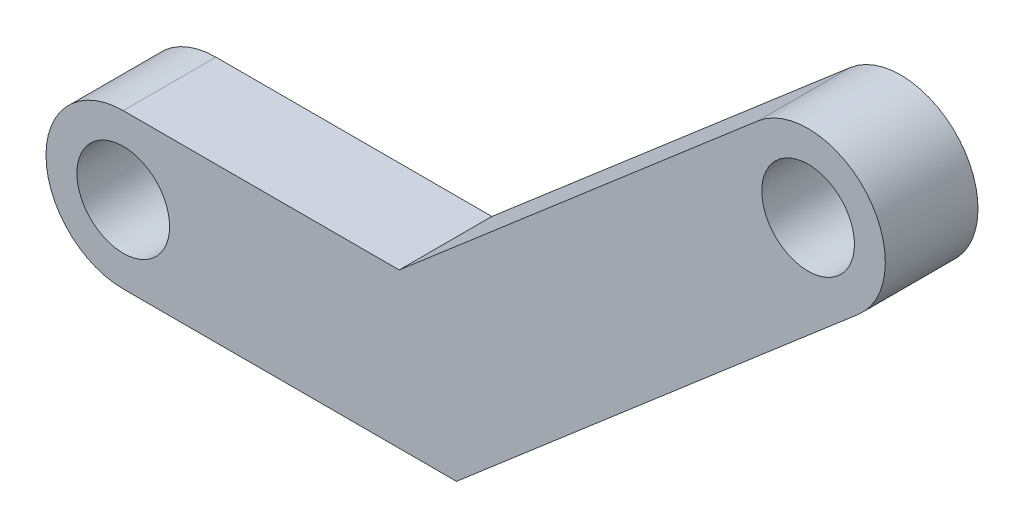
ISO-10303-21;
HEADER;
FILE_DESCRIPTION(('STEP AP214'),'2;1');
FILE_NAME('part.step','',(''),(''),'','','');
FILE_SCHEMA(('AUTOMOTIVE_DESIGN { 1 0 10303 214 1 1 1 1 }'));
ENDSEC;
DATA;
#1=APPLICATION_CONTEXT('core data for automotive mechanical design processes');
#2=APPLICATION_PROTOCOL_DEFINITION('international standard','automotive_design',2000,#1);
#3=PRODUCT_CONTEXT('',#1,'mechanical');
#4=PRODUCT('Part','Part','',(#3));
#5=PRODUCT_RELATED_PRODUCT_CATEGORY('part','',(#4));
#6=PRODUCT_DEFINITION_FORMATION('','',#4);
#7=PRODUCT_DEFINITION_CONTEXT('part definition',#1,'design');
#8=PRODUCT_DEFINITION('design','',#6,#7);
#9=PRODUCT_DEFINITION_SHAPE('','',#8);
#10=(LENGTH_UNIT() NAMED_UNIT(*) SI_UNIT(.MILLI.,.METRE.));
#11=(NAMED_UNIT(*) PLANE_ANGLE_UNIT() SI_UNIT($,.RADIAN.));
#12=(NAMED_UNIT(*) SI_UNIT($,.STERADIAN.) SOLID_ANGLE_UNIT());
#13=UNCERTAINTY_MEASURE_WITH_UNIT(LENGTH_MEASURE(1.E-05),#10,'distance_accuracy_value','');
#14=(GEOMETRIC_REPRESENTATION_CONTEXT(3) GLOBAL_UNCERTAINTY_ASSIGNED_CONTEXT((#13)) GLOBAL_UNIT_ASSIGNED_CONTEXT((#10,
#11,#12)) REPRESENTATION_CONTEXT('',''));
#15=CARTESIAN_POINT('',(0.,0.,0.));
#16=DIRECTION('',(0.,0.,1.));
#17=DIRECTION('',(1.,0.,0.));
#18=AXIS2_PLACEMENT_3D('',#15,#16,#17);
#19=CARTESIAN_POINT('',(91.988845386276,116.522530275384,30.));
#20=DIRECTION('',(0.,0.,-1.));
#21=DIRECTION('',(-1.,0.,0.));
#22=AXIS2_PLACEMENT_3D('',#19,#20,#21);
#23=PLANE('',#22);
#24=CARTESIAN_POINT('',(91.988845386276,116.522530275384,30.));
#25=DIRECTION('',(0.,0.,1.));
#26=DIRECTION('',(-1.,0.,0.));
#27=AXIS2_PLACEMENT_3D('',#24,#25,#26);
#28=CIRCLE('',#27,25.);
#29=CARTESIAN_POINT('',(108.287997248667,97.5663268430852,30.));
#30=VERTEX_POINT('',#29);
#31=CARTESIAN_POINT('',(75.6896935238848,135.478733707683,30.));
#32=VERTEX_POINT('',#31);
#33=EDGE_CURVE('E133',#30,#32,#28,.T.);
#34=ORIENTED_EDGE('',*,*,#33,.T.);
#35=DIRECTION('',(-0.758248137291966,-0.651966074495648,0.));
#36=VECTOR('',#35,1.);
#37=CARTESIAN_POINT('',(75.6896935238848,135.478733707683,30.));
#38=LINE('',#37,#36);
#39=CARTESIAN_POINT('',(-40.3812636027174,35.6772009916923,30.));
#40=VERTEX_POINT('',#39);
#41=EDGE_CURVE('E91',#32,#40,#38,.T.);
#42=ORIENTED_EDGE('',*,*,#41,.T.);
#43=DIRECTION('',(-1.,0.,0.));
#44=VECTOR('',#43,1.);
#45=CARTESIAN_POINT('',(-40.3812636027174,35.6772009916923,30.));
#46=LINE('',#45,#44);
#47=CARTESIAN_POINT('',(-129.711154613724,35.6772009916923,30.));
#48=VERTEX_POINT('',#47);
#49=EDGE_CURVE('E104',#40,#48,#46,.T.);
#50=ORIENTED_EDGE('',*,*,#49,.T.);
#51=CARTESIAN_POINT('',(-129.711154613724,10.6772009916922,30.));
#52=DIRECTION('',(0.,0.,1.));
#53=DIRECTION('',(1.,0.,0.));
#54=AXIS2_PLACEMENT_3D('',#51,#52,#53);
#55=CIRCLE('',#54,25.);
#56=CARTESIAN_POINT('',(-129.711154613724,-14.3227990083078,30.));
#57=VERTEX_POINT('',#56);
#58=EDGE_CURVE('E98',#48,#57,#55,.T.);
#59=ORIENTED_EDGE('',*,*,#58,.T.);
#60=DIRECTION('',(1.,0.,0.));
#61=VECTOR('',#60,1.);
#62=CARTESIAN_POINT('',(-21.8410456247305,-14.3227990083077,30.));
#63=LINE('',#62,#61);
#64=CARTESIAN_POINT('',(-21.8410456247305,-14.3227990083077,30.));
#65=VERTEX_POINT('',#64);
#66=EDGE_CURVE('E102',#57,#65,#63,.T.);
#67=ORIENTED_EDGE('',*,*,#66,.T.);
#68=DIRECTION('',(0.758248137291965,0.651966074495648,0.));
#69=VECTOR('',#68,1.);
#70=CARTESIAN_POINT('',(108.287997248667,97.5663268430852,30.));
#71=LINE('',#70,#69);
#72=EDGE_CURVE('E54',#65,#30,#71,.T.);
#73=ORIENTED_EDGE('',*,*,#72,.T.);
#74=EDGE_LOOP('',(#34,#42,#50,#59,#67,#73));
#75=FACE_BOUND('',#74,.T.);
#76=CARTESIAN_POINT('',(91.988845386276,116.522530275384,30.));
#77=DIRECTION('',(0.,0.,1.));
#78=DIRECTION('',(1.,0.,0.));
#79=AXIS2_PLACEMENT_3D('',#76,#77,#78);
#80=CIRCLE('',#79,15.);
#81=CARTESIAN_POINT('',(106.988845386276,116.522530275384,30.));
#82=VERTEX_POINT('',#81);
#83=EDGE_CURVE('E126',#82,#82,#80,.T.);
#84=ORIENTED_EDGE('',*,*,#83,.F.);
#85=EDGE_LOOP('',(#84));
#86=FACE_BOUND('',#85,.T.);
#87=CARTESIAN_POINT('',(-129.711154613724,10.6772009916922,30.));
#88=DIRECTION('',(0.,0.,1.));
#89=DIRECTION('',(1.,0.,0.));
#90=AXIS2_PLACEMENT_3D('',#87,#88,#89);
#91=CIRCLE('',#90,15.);
#92=CARTESIAN_POINT('',(-114.711154613724,10.6772009916922,30.));
#93=VERTEX_POINT('',#92);
#94=EDGE_CURVE('E174',#93,#93,#91,.T.);
#95=ORIENTED_EDGE('',*,*,#94,.F.);
#96=EDGE_LOOP('',(#95));
#97=FACE_BOUND('',#96,.T.);
#98=ADVANCED_FACE('F37',(#75,#86,#97),#23,.F.);
#99=CARTESIAN_POINT('',(91.988845386276,116.522530275384,0.));
#100=DIRECTION('',(0.,0.,-1.));
#101=DIRECTION('',(-1.,0.,0.));
#102=AXIS2_PLACEMENT_3D('',#99,#100,#101);
#103=PLANE('',#102);
#104=CARTESIAN_POINT('',(91.988845386276,116.522530275384,0.));
#105=DIRECTION('',(0.,0.,1.));
#106=DIRECTION('',(1.,0.,0.));
#107=AXIS2_PLACEMENT_3D('',#104,#105,#106);
#108=CIRCLE('',#107,15.);
#109=CARTESIAN_POINT('',(106.988845386276,116.522530275384,0.));
#110=VERTEX_POINT('',#109);
#111=EDGE_CURVE('E179',#110,#110,#108,.T.);
#112=ORIENTED_EDGE('',*,*,#111,.T.);
#113=EDGE_LOOP('',(#112));
#114=FACE_BOUND('',#113,.T.);
#115=CARTESIAN_POINT('',(91.988845386276,116.522530275384,0.));
#116=DIRECTION('',(0.,0.,1.));
#117=DIRECTION('',(-1.,0.,0.));
#118=AXIS2_PLACEMENT_3D('',#115,#116,#117);
#119=CIRCLE('',#118,25.);
#120=CARTESIAN_POINT('',(108.287997248667,97.5663268430852,0.));
#121=VERTEX_POINT('',#120);
#122=CARTESIAN_POINT('',(75.6896935238848,135.478733707683,0.));
#123=VERTEX_POINT('',#122);
#124=EDGE_CURVE('E122',#121,#123,#119,.T.);
#125=ORIENTED_EDGE('',*,*,#124,.F.);
#126=DIRECTION('',(0.758248137291965,0.651966074495648,0.));
#127=VECTOR('',#126,1.);
#128=CARTESIAN_POINT('',(108.287997248667,97.5663268430852,0.));
#129=LINE('',#128,#127);
#130=CARTESIAN_POINT('',(-21.8410456247305,-14.3227990083077,0.));
#131=VERTEX_POINT('',#130);
#132=EDGE_CURVE('E83',#131,#121,#129,.T.);
#133=ORIENTED_EDGE('',*,*,#132,.F.);
#134=DIRECTION('',(1.,0.,0.));
#135=VECTOR('',#134,1.);
#136=CARTESIAN_POINT('',(-21.8410456247305,-14.3227990083077,0.));
#137=LINE('',#136,#135);
#138=CARTESIAN_POINT('',(-129.711154613724,-14.3227990083078,0.));
#139=VERTEX_POINT('',#138);
#140=EDGE_CURVE('E77',#139,#131,#137,.T.);
#141=ORIENTED_EDGE('',*,*,#140,.F.);
#142=CARTESIAN_POINT('',(-129.711154613724,10.6772009916922,0.));
#143=DIRECTION('',(0.,0.,1.));
#144=DIRECTION('',(1.,0.,0.));
#145=AXIS2_PLACEMENT_3D('',#142,#143,#144);
#146=CIRCLE('',#145,25.);
#147=CARTESIAN_POINT('',(-129.711154613724,35.6772009916923,0.));
#148=VERTEX_POINT('',#147);
#149=EDGE_CURVE('E112',#148,#139,#146,.T.);
#150=ORIENTED_EDGE('',*,*,#149,.F.);
#151=DIRECTION('',(-1.,0.,0.));
#152=VECTOR('',#151,1.);
#153=CARTESIAN_POINT('',(-40.3812636027174,35.6772009916923,0.));
#154=LINE('',#153,#152);
#155=CARTESIAN_POINT('',(-40.3812636027174,35.6772009916923,0.));
#156=VERTEX_POINT('',#155);
#157=EDGE_CURVE('E128',#156,#148,#154,.T.);
#158=ORIENTED_EDGE('',*,*,#157,.F.);
#159=DIRECTION('',(-0.758248137291966,-0.651966074495648,0.));
#160=VECTOR('',#159,1.);
#161=CARTESIAN_POINT('',(75.6896935238848,135.478733707683,0.));
#162=LINE('',#161,#160);
#163=EDGE_CURVE('E125',#123,#156,#162,.T.);
#164=ORIENTED_EDGE('',*,*,#163,.F.);
#165=EDGE_LOOP('',(#125,#133,#141,#150,#158,#164));
#166=FACE_BOUND('',#165,.T.);
#167=CARTESIAN_POINT('',(-129.711154613724,10.6772009916922,0.));
#168=DIRECTION('',(0.,0.,1.));
#169=DIRECTION('',(1.,0.,0.));
#170=AXIS2_PLACEMENT_3D('',#167,#168,#169);
#171=CIRCLE('',#170,15.);
#172=CARTESIAN_POINT('',(-114.711154613724,10.6772009916922,0.));
#173=VERTEX_POINT('',#172);
#174=EDGE_CURVE('E177',#173,#173,#171,.T.);
#175=ORIENTED_EDGE('',*,*,#174,.T.);
#176=EDGE_LOOP('',(#175));
#177=FACE_BOUND('',#176,.T.);
#178=ADVANCED_FACE('F142',(#114,#166,#177),#103,.T.);
#179=CARTESIAN_POINT('',(91.988845386276,116.522530275384,30.));
#180=DIRECTION('',(0.,0.,-1.));
#181=DIRECTION('',(-1.,0.,0.));
#182=AXIS2_PLACEMENT_3D('',#179,#180,#181);
#183=CYLINDRICAL_SURFACE('',#182,25.);
#184=ORIENTED_EDGE('',*,*,#124,.T.);
#185=DIRECTION('',(0.,0.,-1.));
#186=VECTOR('',#185,1.);
#187=CARTESIAN_POINT('',(75.6896935238848,135.478733707683,30.));
#188=LINE('',#187,#186);
#189=EDGE_CURVE('E11',#32,#123,#188,.T.);
#190=ORIENTED_EDGE('',*,*,#189,.F.);
#191=ORIENTED_EDGE('',*,*,#33,.F.);
#192=DIRECTION('',(0.,0.,-1.));
#193=VECTOR('',#192,1.);
#194=CARTESIAN_POINT('',(108.287997248667,97.5663268430852,30.));
#195=LINE('',#194,#193);
#196=EDGE_CURVE('E118',#30,#121,#195,.T.);
#197=ORIENTED_EDGE('',*,*,#196,.T.);
#198=EDGE_LOOP('',(#184,#190,#191,#197));
#199=FACE_BOUND('',#198,.T.);
#200=ADVANCED_FACE('F39',(#199),#183,.T.);
#201=CARTESIAN_POINT('',(75.6896935238848,135.478733707683,30.));
#202=DIRECTION('',(0.651966074495648,-0.758248137291966,0.));
#203=DIRECTION('',(0.758248137291966,0.651966074495648,0.));
#204=AXIS2_PLACEMENT_3D('',#201,#202,#203);
#205=PLANE('',#204);
#206=ORIENTED_EDGE('',*,*,#163,.T.);
#207=DIRECTION('',(0.,0.,-1.));
#208=VECTOR('',#207,1.);
#209=CARTESIAN_POINT('',(-40.3812636027174,35.6772009916923,30.));
#210=LINE('',#209,#208);
#211=EDGE_CURVE('E46',#40,#156,#210,.T.);
#212=ORIENTED_EDGE('',*,*,#211,.F.);
#213=ORIENTED_EDGE('',*,*,#41,.F.);
#214=ORIENTED_EDGE('',*,*,#189,.T.);
#215=EDGE_LOOP('',(#206,#212,#213,#214));
#216=FACE_BOUND('',#215,.T.);
#217=ADVANCED_FACE('F226',(#216),#205,.F.);
#218=CARTESIAN_POINT('',(-40.3812636027174,35.6772009916923,30.));
#219=DIRECTION('',(0.,-1.,0.));
#220=DIRECTION('',(0.,0.,-1.));
#221=AXIS2_PLACEMENT_3D('',#218,#219,#220);
#222=PLANE('',#221);
#223=ORIENTED_EDGE('',*,*,#157,.T.);
#224=DIRECTION('',(0.,0.,-1.));
#225=VECTOR('',#224,1.);
#226=CARTESIAN_POINT('',(-129.711154613724,35.6772009916923,30.));
#227=LINE('',#226,#225);
#228=EDGE_CURVE('E113',#48,#148,#227,.T.);
#229=ORIENTED_EDGE('',*,*,#228,.F.);
#230=ORIENTED_EDGE('',*,*,#49,.F.);
#231=ORIENTED_EDGE('',*,*,#211,.T.);
#232=EDGE_LOOP('',(#223,#229,#230,#231));
#233=FACE_BOUND('',#232,.T.);
#234=ADVANCED_FACE('F139',(#233),#222,.F.);
#235=CARTESIAN_POINT('',(-129.711154613724,10.6772009916922,30.));
#236=DIRECTION('',(0.,0.,-1.));
#237=DIRECTION('',(-1.,0.,0.));
#238=AXIS2_PLACEMENT_3D('',#235,#236,#237);
#239=CYLINDRICAL_SURFACE('',#238,25.);
#240=ORIENTED_EDGE('',*,*,#149,.T.);
#241=DIRECTION('',(0.,0.,-1.));
#242=VECTOR('',#241,1.);
#243=CARTESIAN_POINT('',(-129.711154613724,-14.3227990083078,30.));
#244=LINE('',#243,#242);
#245=EDGE_CURVE('E109',#57,#139,#244,.T.);
#246=ORIENTED_EDGE('',*,*,#245,.F.);
#247=ORIENTED_EDGE('',*,*,#58,.F.);
#248=ORIENTED_EDGE('',*,*,#228,.T.);
#249=EDGE_LOOP('',(#240,#246,#247,#248));
#250=FACE_BOUND('',#249,.T.);
#251=ADVANCED_FACE('F110',(#250),#239,.T.);
#252=CARTESIAN_POINT('',(-21.8410456247305,-14.3227990083077,30.));
#253=DIRECTION('',(0.,1.,0.));
#254=DIRECTION('',(0.,0.,1.));
#255=AXIS2_PLACEMENT_3D('',#252,#253,#254);
#256=PLANE('',#255);
#257=ORIENTED_EDGE('',*,*,#140,.T.);
#258=DIRECTION('',(0.,0.,-1.));
#259=VECTOR('',#258,1.);
#260=CARTESIAN_POINT('',(-21.8410456247305,-14.3227990083077,30.));
#261=LINE('',#260,#259);
#262=EDGE_CURVE('E114',#65,#131,#261,.T.);
#263=ORIENTED_EDGE('',*,*,#262,.F.);
#264=ORIENTED_EDGE('',*,*,#66,.F.);
#265=ORIENTED_EDGE('',*,*,#245,.T.);
#266=EDGE_LOOP('',(#257,#263,#264,#265));
#267=FACE_BOUND('',#266,.T.);
#268=ADVANCED_FACE('F116',(#267),#256,.F.);
#269=CARTESIAN_POINT('',(108.287997248667,97.5663268430852,30.));
#270=DIRECTION('',(-0.651966074495648,0.758248137291965,0.));
#271=DIRECTION('',(-0.758248137291966,-0.651966074495648,0.));
#272=AXIS2_PLACEMENT_3D('',#269,#270,#271);
#273=PLANE('',#272);
#274=ORIENTED_EDGE('',*,*,#132,.T.);
#275=ORIENTED_EDGE('',*,*,#196,.F.);
#276=ORIENTED_EDGE('',*,*,#72,.F.);
#277=ORIENTED_EDGE('',*,*,#262,.T.);
#278=EDGE_LOOP('',(#274,#275,#276,#277));
#279=FACE_BOUND('',#278,.T.);
#280=ADVANCED_FACE('F147',(#279),#273,.F.);
#281=CARTESIAN_POINT('',(91.988845386276,116.522530275384,30.));
#282=DIRECTION('',(0.,0.,-1.));
#283=DIRECTION('',(-1.,0.,0.));
#284=AXIS2_PLACEMENT_3D('',#281,#282,#283);
#285=CYLINDRICAL_SURFACE('',#284,15.);
#286=ORIENTED_EDGE('',*,*,#83,.T.);
#287=EDGE_LOOP('',(#286));
#288=FACE_BOUND('',#287,.T.);
#289=ORIENTED_EDGE('',*,*,#111,.F.);
#290=EDGE_LOOP('',(#289));
#291=FACE_BOUND('',#290,.T.);
#292=ADVANCED_FACE('F149',(#288,#291),#285,.F.);
#293=CARTESIAN_POINT('',(-129.711154613724,10.6772009916922,30.));
#294=DIRECTION('',(0.,0.,-1.));
#295=DIRECTION('',(-1.,0.,0.));
#296=AXIS2_PLACEMENT_3D('',#293,#294,#295);
#297=CYLINDRICAL_SURFACE('',#296,15.);
#298=ORIENTED_EDGE('',*,*,#94,.T.);
#299=EDGE_LOOP('',(#298));
#300=FACE_BOUND('',#299,.T.);
#301=ORIENTED_EDGE('',*,*,#174,.F.);
#302=EDGE_LOOP('',(#301));
#303=FACE_BOUND('',#302,.T.);
#304=ADVANCED_FACE('F155',(#300,#303),#297,.F.);
#305=CLOSED_SHELL('',(#98,#178,#200,#217,#234,#251,#268,#280,#292,#304));
#306=MANIFOLD_SOLID_BREP('B2',#305);
#307=ADVANCED_BREP_SHAPE_REPRESENTATION('',(#18,#306),#14);
#308=SHAPE_DEFINITION_REPRESENTATION(#9,#307);
ENDSEC;
END-ISO-10303-21;
